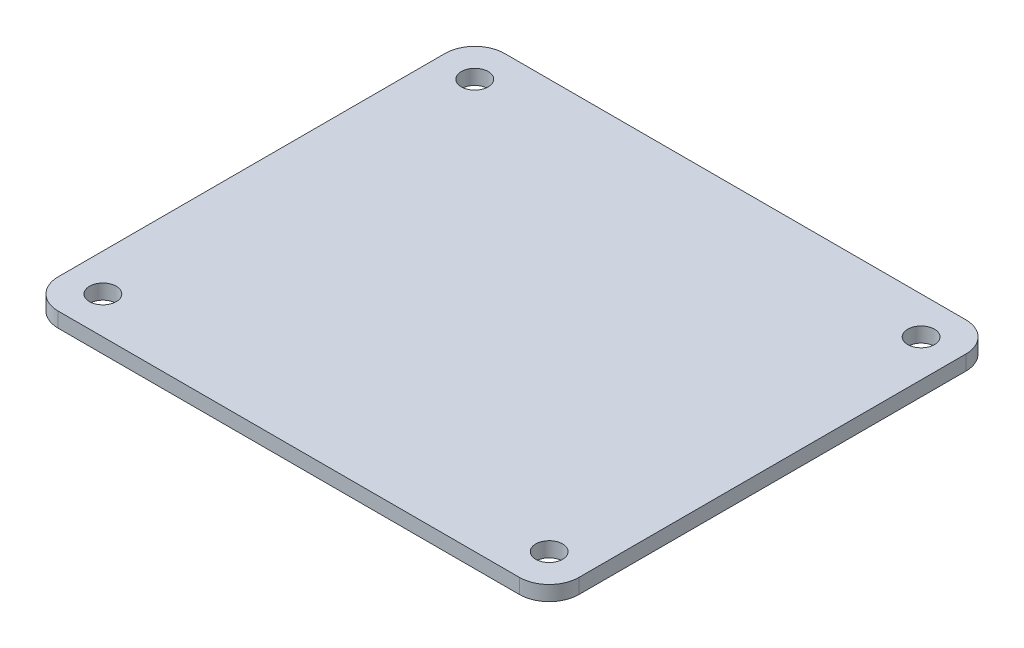
ISO-10303-21;
HEADER;
FILE_DESCRIPTION(('STEP AP214'),'2;1');
FILE_NAME('part.step','',(''),(''),'','','');
FILE_SCHEMA(('AUTOMOTIVE_DESIGN { 1 0 10303 214 1 1 1 1 }'));
ENDSEC;
DATA;
#1=APPLICATION_CONTEXT('core data for automotive mechanical design processes');
#2=APPLICATION_PROTOCOL_DEFINITION('international standard','automotive_design',2000,#1);
#3=PRODUCT_CONTEXT('',#1,'mechanical');
#4=PRODUCT('Part','Part','',(#3));
#5=PRODUCT_RELATED_PRODUCT_CATEGORY('part','',(#4));
#6=PRODUCT_DEFINITION_FORMATION('','',#4);
#7=PRODUCT_DEFINITION_CONTEXT('part definition',#1,'design');
#8=PRODUCT_DEFINITION('design','',#6,#7);
#9=PRODUCT_DEFINITION_SHAPE('','',#8);
#10=(LENGTH_UNIT() NAMED_UNIT(*) SI_UNIT(.MILLI.,.METRE.));
#11=(NAMED_UNIT(*) PLANE_ANGLE_UNIT() SI_UNIT($,.RADIAN.));
#12=(NAMED_UNIT(*) SI_UNIT($,.STERADIAN.) SOLID_ANGLE_UNIT());
#13=UNCERTAINTY_MEASURE_WITH_UNIT(LENGTH_MEASURE(1.E-05),#10,'distance_accuracy_value','');
#14=(GEOMETRIC_REPRESENTATION_CONTEXT(3) GLOBAL_UNCERTAINTY_ASSIGNED_CONTEXT((#13)) GLOBAL_UNIT_ASSIGNED_CONTEXT((#10,
#11,#12)) REPRESENTATION_CONTEXT('',''));
#15=CARTESIAN_POINT('',(0.,0.,0.));
#16=DIRECTION('',(0.,0.,1.));
#17=DIRECTION('',(1.,0.,0.));
#18=AXIS2_PLACEMENT_3D('',#15,#16,#17);
#19=CARTESIAN_POINT('',(61.0820855722367,1.,19.4531884902381));
#20=DIRECTION('',(-1.,0.,0.));
#21=DIRECTION('',(0.,0.,1.));
#22=AXIS2_PLACEMENT_3D('',#19,#20,#21);
#23=PLANE('',#22);
#24=DIRECTION('',(0.,0.,-1.));
#25=VECTOR('',#24,1.);
#26=CARTESIAN_POINT('',(61.0820855722367,1.,19.4531884902381));
#27=LINE('',#26,#25);
#28=CARTESIAN_POINT('',(61.0820855722367,1.,17.4531884902381));
#29=VERTEX_POINT('',#28);
#30=CARTESIAN_POINT('',(61.0820855722367,1.,-8.54681150976191));
#31=VERTEX_POINT('',#30);
#32=EDGE_CURVE('E120',#29,#31,#27,.T.);
#33=ORIENTED_EDGE('',*,*,#32,.F.);
#34=DIRECTION('',(0.,-1.,0.));
#35=VECTOR('',#34,1.);
#36=CARTESIAN_POINT('',(61.0820855722367,1.,17.4531884902381));
#37=LINE('',#36,#35);
#38=CARTESIAN_POINT('',(61.0820855722367,0.,17.4531884902381));
#39=VERTEX_POINT('',#38);
#40=EDGE_CURVE('E105',#29,#39,#37,.T.);
#41=ORIENTED_EDGE('',*,*,#40,.T.);
#42=DIRECTION('',(0.,0.,-1.));
#43=VECTOR('',#42,1.);
#44=CARTESIAN_POINT('',(61.0820855722367,0.,19.4531884902381));
#45=LINE('',#44,#43);
#46=CARTESIAN_POINT('',(61.0820855722367,0.,-8.54681150976191));
#47=VERTEX_POINT('',#46);
#48=EDGE_CURVE('E117',#39,#47,#45,.T.);
#49=ORIENTED_EDGE('',*,*,#48,.T.);
#50=DIRECTION('',(0.,-1.,0.));
#51=VECTOR('',#50,1.);
#52=CARTESIAN_POINT('',(61.0820855722367,1.,-8.54681150976192));
#53=LINE('',#52,#51);
#54=EDGE_CURVE('E122',#47,#31,#53,.F.);
#55=ORIENTED_EDGE('',*,*,#54,.T.);
#56=EDGE_LOOP('',(#33,#41,#49,#55));
#57=FACE_BOUND('',#56,.T.);
#58=ADVANCED_FACE('F35',(#57),#23,.F.);
#59=CARTESIAN_POINT('',(61.0820855722367,1.,-10.5468115097619));
#60=DIRECTION('',(0.,0.,1.));
#61=DIRECTION('',(1.,0.,0.));
#62=AXIS2_PLACEMENT_3D('',#59,#60,#61);
#63=PLANE('',#62);
#64=DIRECTION('',(-1.,0.,0.));
#65=VECTOR('',#64,1.);
#66=CARTESIAN_POINT('',(61.0820855722367,0.,-10.5468115097619));
#67=LINE('',#66,#65);
#68=CARTESIAN_POINT('',(59.0820855722367,0.,-10.5468115097619));
#69=VERTEX_POINT('',#68);
#70=CARTESIAN_POINT('',(28.0820855722367,0.,-10.5468115097619));
#71=VERTEX_POINT('',#70);
#72=EDGE_CURVE('E126',#69,#71,#67,.T.);
#73=ORIENTED_EDGE('',*,*,#72,.T.);
#74=DIRECTION('',(0.,-1.,0.));
#75=VECTOR('',#74,1.);
#76=CARTESIAN_POINT('',(28.0820855722367,1.,-10.5468115097619));
#77=LINE('',#76,#75);
#78=CARTESIAN_POINT('',(28.0820855722367,1.,-10.5468115097619));
#79=VERTEX_POINT('',#78);
#80=EDGE_CURVE('E11',#71,#79,#77,.F.);
#81=ORIENTED_EDGE('',*,*,#80,.T.);
#82=DIRECTION('',(-1.,0.,0.));
#83=VECTOR('',#82,1.);
#84=CARTESIAN_POINT('',(61.0820855722367,1.,-10.5468115097619));
#85=LINE('',#84,#83);
#86=CARTESIAN_POINT('',(59.0820855722367,1.,-10.5468115097619));
#87=VERTEX_POINT('',#86);
#88=EDGE_CURVE('E166',#87,#79,#85,.T.);
#89=ORIENTED_EDGE('',*,*,#88,.F.);
#90=DIRECTION('',(0.,-1.,0.));
#91=VECTOR('',#90,1.);
#92=CARTESIAN_POINT('',(59.0820855722367,1.,-10.5468115097619));
#93=LINE('',#92,#91);
#94=EDGE_CURVE('E43',#87,#69,#93,.T.);
#95=ORIENTED_EDGE('',*,*,#94,.T.);
#96=EDGE_LOOP('',(#73,#81,#89,#95));
#97=FACE_BOUND('',#96,.T.);
#98=ADVANCED_FACE('F164',(#97),#63,.F.);
#99=CARTESIAN_POINT('',(26.0820855722367,1.,19.4531884902381));
#100=DIRECTION('',(1.,0.,0.));
#101=DIRECTION('',(0.,0.,-1.));
#102=AXIS2_PLACEMENT_3D('',#99,#100,#101);
#103=PLANE('',#102);
#104=DIRECTION('',(0.,0.,1.));
#105=VECTOR('',#104,1.);
#106=CARTESIAN_POINT('',(26.0820855722367,0.,19.4531884902381));
#107=LINE('',#106,#105);
#108=CARTESIAN_POINT('',(26.0820855722367,0.,-8.54681150976192));
#109=VERTEX_POINT('',#108);
#110=CARTESIAN_POINT('',(26.0820855722367,0.,17.4531884902381));
#111=VERTEX_POINT('',#110);
#112=EDGE_CURVE('E130',#109,#111,#107,.T.);
#113=ORIENTED_EDGE('',*,*,#112,.T.);
#114=DIRECTION('',(0.,-1.,0.));
#115=VECTOR('',#114,1.);
#116=CARTESIAN_POINT('',(26.0820855722367,1.,17.4531884902381));
#117=LINE('',#116,#115);
#118=CARTESIAN_POINT('',(26.0820855722367,1.,17.4531884902381));
#119=VERTEX_POINT('',#118);
#120=EDGE_CURVE('E50',#111,#119,#117,.F.);
#121=ORIENTED_EDGE('',*,*,#120,.T.);
#122=DIRECTION('',(0.,0.,1.));
#123=VECTOR('',#122,1.);
#124=CARTESIAN_POINT('',(26.0820855722367,1.,19.4531884902381));
#125=LINE('',#124,#123);
#126=CARTESIAN_POINT('',(26.0820855722367,1.,-8.54681150976192));
#127=VERTEX_POINT('',#126);
#128=EDGE_CURVE('E174',#127,#119,#125,.T.);
#129=ORIENTED_EDGE('',*,*,#128,.F.);
#130=DIRECTION('',(0.,-1.,0.));
#131=VECTOR('',#130,1.);
#132=CARTESIAN_POINT('',(26.0820855722367,1.,-8.54681150976192));
#133=LINE('',#132,#131);
#134=EDGE_CURVE('E157',#127,#109,#133,.T.);
#135=ORIENTED_EDGE('',*,*,#134,.T.);
#136=EDGE_LOOP('',(#113,#121,#129,#135));
#137=FACE_BOUND('',#136,.T.);
#138=ADVANCED_FACE('F173',(#137),#103,.F.);
#139=CARTESIAN_POINT('',(61.0820855722367,1.,19.4531884902381));
#140=DIRECTION('',(0.,0.,-1.));
#141=DIRECTION('',(-1.,0.,0.));
#142=AXIS2_PLACEMENT_3D('',#139,#140,#141);
#143=PLANE('',#142);
#144=DIRECTION('',(1.,0.,0.));
#145=VECTOR('',#144,1.);
#146=CARTESIAN_POINT('',(61.0820855722367,0.,19.4531884902381));
#147=LINE('',#146,#145);
#148=CARTESIAN_POINT('',(28.0820855722367,0.,19.4531884902381));
#149=VERTEX_POINT('',#148);
#150=CARTESIAN_POINT('',(59.0820855722367,0.,19.4531884902381));
#151=VERTEX_POINT('',#150);
#152=EDGE_CURVE('E140',#149,#151,#147,.T.);
#153=ORIENTED_EDGE('',*,*,#152,.T.);
#154=DIRECTION('',(0.,-1.,0.));
#155=VECTOR('',#154,1.);
#156=CARTESIAN_POINT('',(59.0820855722367,1.,19.4531884902381));
#157=LINE('',#156,#155);
#158=CARTESIAN_POINT('',(59.0820855722367,1.,19.4531884902381));
#159=VERTEX_POINT('',#158);
#160=EDGE_CURVE('E106',#151,#159,#157,.F.);
#161=ORIENTED_EDGE('',*,*,#160,.T.);
#162=DIRECTION('',(1.,0.,0.));
#163=VECTOR('',#162,1.);
#164=CARTESIAN_POINT('',(61.0820855722367,1.,19.4531884902381));
#165=LINE('',#164,#163);
#166=CARTESIAN_POINT('',(28.0820855722367,1.,19.4531884902381));
#167=VERTEX_POINT('',#166);
#168=EDGE_CURVE('E136',#167,#159,#165,.T.);
#169=ORIENTED_EDGE('',*,*,#168,.F.);
#170=DIRECTION('',(0.,-1.,0.));
#171=VECTOR('',#170,1.);
#172=CARTESIAN_POINT('',(28.0820855722367,1.,19.4531884902381));
#173=LINE('',#172,#171);
#174=EDGE_CURVE('E111',#167,#149,#173,.T.);
#175=ORIENTED_EDGE('',*,*,#174,.T.);
#176=EDGE_LOOP('',(#153,#161,#169,#175));
#177=FACE_BOUND('',#176,.T.);
#178=ADVANCED_FACE('F214',(#177),#143,.F.);
#179=CARTESIAN_POINT('',(0.,1.,0.));
#180=DIRECTION('',(0.,1.,0.));
#181=DIRECTION('',(0.,0.,1.));
#182=AXIS2_PLACEMENT_3D('',#179,#180,#181);
#183=PLANE('',#182);
#184=CARTESIAN_POINT('',(58.5820855722367,1.,-8.04681150976192));
#185=DIRECTION('',(0.,1.,0.));
#186=DIRECTION('',(0.,0.,1.));
#187=AXIS2_PLACEMENT_3D('',#184,#185,#186);
#188=CIRCLE('',#187,0.899999999999997);
#189=CARTESIAN_POINT('',(58.5820855722367,1.,-7.14681150976192));
#190=VERTEX_POINT('',#189);
#191=EDGE_CURVE('E183',#190,#190,#188,.T.);
#192=ORIENTED_EDGE('',*,*,#191,.F.);
#193=EDGE_LOOP('',(#192));
#194=FACE_BOUND('',#193,.T.);
#195=CARTESIAN_POINT('',(28.5820855722367,1.,-8.04681150976192));
#196=DIRECTION('',(0.,1.,0.));
#197=DIRECTION('',(0.,0.,1.));
#198=AXIS2_PLACEMENT_3D('',#195,#196,#197);
#199=CIRCLE('',#198,0.9);
#200=CARTESIAN_POINT('',(28.5820855722367,1.,-7.14681150976192));
#201=VERTEX_POINT('',#200);
#202=EDGE_CURVE('E189',#201,#201,#199,.T.);
#203=ORIENTED_EDGE('',*,*,#202,.F.);
#204=EDGE_LOOP('',(#203));
#205=FACE_BOUND('',#204,.T.);
#206=CARTESIAN_POINT('',(28.5820855722367,1.,16.9531884902381));
#207=DIRECTION('',(0.,1.,0.));
#208=DIRECTION('',(0.,0.,1.));
#209=AXIS2_PLACEMENT_3D('',#206,#207,#208);
#210=CIRCLE('',#209,0.900000000000001);
#211=CARTESIAN_POINT('',(28.5820855722367,1.,17.8531884902381));
#212=VERTEX_POINT('',#211);
#213=EDGE_CURVE('E195',#212,#212,#210,.T.);
#214=ORIENTED_EDGE('',*,*,#213,.F.);
#215=EDGE_LOOP('',(#214));
#216=FACE_BOUND('',#215,.T.);
#217=CARTESIAN_POINT('',(58.5820855722367,1.,16.9531884902381));
#218=DIRECTION('',(0.,1.,0.));
#219=DIRECTION('',(0.,0.,1.));
#220=AXIS2_PLACEMENT_3D('',#217,#218,#219);
#221=CIRCLE('',#220,0.899999999999996);
#222=CARTESIAN_POINT('',(58.5820855722367,1.,17.8531884902381));
#223=VERTEX_POINT('',#222);
#224=EDGE_CURVE('E133',#223,#223,#221,.T.);
#225=ORIENTED_EDGE('',*,*,#224,.F.);
#226=EDGE_LOOP('',(#225));
#227=FACE_BOUND('',#226,.T.);
#228=ORIENTED_EDGE('',*,*,#168,.T.);
#229=CARTESIAN_POINT('',(59.0820855722367,1.,17.4531884902381));
#230=DIRECTION('',(0.,1.,0.));
#231=DIRECTION('',(0.,0.,1.));
#232=AXIS2_PLACEMENT_3D('',#229,#230,#231);
#233=CIRCLE('',#232,2.);
#234=EDGE_CURVE('E155',#159,#29,#233,.T.);
#235=ORIENTED_EDGE('',*,*,#234,.T.);
#236=ORIENTED_EDGE('',*,*,#32,.T.);
#237=CARTESIAN_POINT('',(59.0820855722367,1.,-8.54681150976192));
#238=DIRECTION('',(0.,1.,0.));
#239=DIRECTION('',(0.,0.,1.));
#240=AXIS2_PLACEMENT_3D('',#237,#238,#239);
#241=CIRCLE('',#240,2.);
#242=EDGE_CURVE('E150',#31,#87,#241,.T.);
#243=ORIENTED_EDGE('',*,*,#242,.T.);
#244=ORIENTED_EDGE('',*,*,#88,.T.);
#245=CARTESIAN_POINT('',(28.0820855722367,1.,-8.54681150976192));
#246=DIRECTION('',(0.,1.,0.));
#247=DIRECTION('',(0.,0.,1.));
#248=AXIS2_PLACEMENT_3D('',#245,#246,#247);
#249=CIRCLE('',#248,2.);
#250=EDGE_CURVE('E57',#79,#127,#249,.T.);
#251=ORIENTED_EDGE('',*,*,#250,.T.);
#252=ORIENTED_EDGE('',*,*,#128,.T.);
#253=CARTESIAN_POINT('',(28.0820855722367,1.,17.4531884902381));
#254=DIRECTION('',(0.,1.,0.));
#255=DIRECTION('',(0.,0.,1.));
#256=AXIS2_PLACEMENT_3D('',#253,#254,#255);
#257=CIRCLE('',#256,2.);
#258=EDGE_CURVE('E153',#119,#167,#257,.T.);
#259=ORIENTED_EDGE('',*,*,#258,.T.);
#260=EDGE_LOOP('',(#228,#235,#236,#243,#244,#251,#252,#259));
#261=FACE_BOUND('',#260,.T.);
#262=ADVANCED_FACE('F211',(#194,#205,#216,#227,#261),#183,.T.);
#263=CARTESIAN_POINT('',(0.,0.,0.));
#264=DIRECTION('',(0.,1.,0.));
#265=DIRECTION('',(0.,0.,1.));
#266=AXIS2_PLACEMENT_3D('',#263,#264,#265);
#267=PLANE('',#266);
#268=CARTESIAN_POINT('',(58.5820855722367,0.,-8.04681150976192));
#269=DIRECTION('',(0.,1.,0.));
#270=DIRECTION('',(0.,0.,1.));
#271=AXIS2_PLACEMENT_3D('',#268,#269,#270);
#272=CIRCLE('',#271,0.899999999999997);
#273=CARTESIAN_POINT('',(58.5820855722367,0.,-7.14681150976192));
#274=VERTEX_POINT('',#273);
#275=EDGE_CURVE('E186',#274,#274,#272,.T.);
#276=ORIENTED_EDGE('',*,*,#275,.T.);
#277=EDGE_LOOP('',(#276));
#278=FACE_BOUND('',#277,.T.);
#279=CARTESIAN_POINT('',(28.5820855722367,0.,-8.04681150976192));
#280=DIRECTION('',(0.,1.,0.));
#281=DIRECTION('',(0.,0.,1.));
#282=AXIS2_PLACEMENT_3D('',#279,#280,#281);
#283=CIRCLE('',#282,0.9);
#284=CARTESIAN_POINT('',(28.5820855722367,0.,-7.14681150976192));
#285=VERTEX_POINT('',#284);
#286=EDGE_CURVE('E192',#285,#285,#283,.T.);
#287=ORIENTED_EDGE('',*,*,#286,.T.);
#288=EDGE_LOOP('',(#287));
#289=FACE_BOUND('',#288,.T.);
#290=CARTESIAN_POINT('',(28.5820855722367,0.,16.9531884902381));
#291=DIRECTION('',(0.,1.,0.));
#292=DIRECTION('',(0.,0.,1.));
#293=AXIS2_PLACEMENT_3D('',#290,#291,#292);
#294=CIRCLE('',#293,0.900000000000001);
#295=CARTESIAN_POINT('',(28.5820855722367,0.,17.8531884902381));
#296=VERTEX_POINT('',#295);
#297=EDGE_CURVE('E181',#296,#296,#294,.T.);
#298=ORIENTED_EDGE('',*,*,#297,.T.);
#299=EDGE_LOOP('',(#298));
#300=FACE_BOUND('',#299,.T.);
#301=CARTESIAN_POINT('',(58.5820855722367,0.,16.9531884902381));
#302=DIRECTION('',(0.,1.,0.));
#303=DIRECTION('',(0.,0.,1.));
#304=AXIS2_PLACEMENT_3D('',#301,#302,#303);
#305=CIRCLE('',#304,0.899999999999996);
#306=CARTESIAN_POINT('',(58.5820855722367,0.,17.8531884902381));
#307=VERTEX_POINT('',#306);
#308=EDGE_CURVE('E127',#307,#307,#305,.T.);
#309=ORIENTED_EDGE('',*,*,#308,.T.);
#310=EDGE_LOOP('',(#309));
#311=FACE_BOUND('',#310,.T.);
#312=ORIENTED_EDGE('',*,*,#48,.F.);
#313=CARTESIAN_POINT('',(59.0820855722367,0.,17.4531884902381));
#314=DIRECTION('',(0.,1.,0.));
#315=DIRECTION('',(0.,0.,1.));
#316=AXIS2_PLACEMENT_3D('',#313,#314,#315);
#317=CIRCLE('',#316,2.);
#318=EDGE_CURVE('E101',#39,#151,#317,.F.);
#319=ORIENTED_EDGE('',*,*,#318,.T.);
#320=ORIENTED_EDGE('',*,*,#152,.F.);
#321=CARTESIAN_POINT('',(28.0820855722367,0.,17.4531884902381));
#322=DIRECTION('',(0.,1.,0.));
#323=DIRECTION('',(0.,0.,1.));
#324=AXIS2_PLACEMENT_3D('',#321,#322,#323);
#325=CIRCLE('',#324,2.);
#326=EDGE_CURVE('E112',#149,#111,#325,.F.);
#327=ORIENTED_EDGE('',*,*,#326,.T.);
#328=ORIENTED_EDGE('',*,*,#112,.F.);
#329=CARTESIAN_POINT('',(28.0820855722367,0.,-8.54681150976192));
#330=DIRECTION('',(0.,1.,0.));
#331=DIRECTION('',(0.,0.,1.));
#332=AXIS2_PLACEMENT_3D('',#329,#330,#331);
#333=CIRCLE('',#332,2.);
#334=EDGE_CURVE('E144',#109,#71,#333,.F.);
#335=ORIENTED_EDGE('',*,*,#334,.T.);
#336=ORIENTED_EDGE('',*,*,#72,.F.);
#337=CARTESIAN_POINT('',(59.0820855722367,0.,-8.54681150976192));
#338=DIRECTION('',(0.,1.,0.));
#339=DIRECTION('',(0.,0.,1.));
#340=AXIS2_PLACEMENT_3D('',#337,#338,#339);
#341=CIRCLE('',#340,2.);
#342=EDGE_CURVE('E121',#69,#47,#341,.F.);
#343=ORIENTED_EDGE('',*,*,#342,.T.);
#344=EDGE_LOOP('',(#312,#319,#320,#327,#328,#335,#336,#343));
#345=FACE_BOUND('',#344,.T.);
#346=ADVANCED_FACE('F124',(#278,#289,#300,#311,#345),#267,.F.);
#347=CARTESIAN_POINT('',(59.0820855722367,1.,17.4531884902381));
#348=DIRECTION('',(0.,-1.,0.));
#349=DIRECTION('',(0.,0.,-1.));
#350=AXIS2_PLACEMENT_3D('',#347,#348,#349);
#351=CYLINDRICAL_SURFACE('',#350,2.);
#352=ORIENTED_EDGE('',*,*,#234,.F.);
#353=ORIENTED_EDGE('',*,*,#160,.F.);
#354=ORIENTED_EDGE('',*,*,#318,.F.);
#355=ORIENTED_EDGE('',*,*,#40,.F.);
#356=EDGE_LOOP('',(#352,#353,#354,#355));
#357=FACE_BOUND('',#356,.T.);
#358=ADVANCED_FACE('F104',(#357),#351,.T.);
#359=CARTESIAN_POINT('',(28.0820855722367,1.,17.4531884902381));
#360=DIRECTION('',(0.,-1.,0.));
#361=DIRECTION('',(0.,0.,-1.));
#362=AXIS2_PLACEMENT_3D('',#359,#360,#361);
#363=CYLINDRICAL_SURFACE('',#362,2.);
#364=ORIENTED_EDGE('',*,*,#258,.F.);
#365=ORIENTED_EDGE('',*,*,#120,.F.);
#366=ORIENTED_EDGE('',*,*,#326,.F.);
#367=ORIENTED_EDGE('',*,*,#174,.F.);
#368=EDGE_LOOP('',(#364,#365,#366,#367));
#369=FACE_BOUND('',#368,.T.);
#370=ADVANCED_FACE('F222',(#369),#363,.T.);
#371=CARTESIAN_POINT('',(28.0820855722367,1.,-8.54681150976192));
#372=DIRECTION('',(0.,-1.,0.));
#373=DIRECTION('',(0.,0.,-1.));
#374=AXIS2_PLACEMENT_3D('',#371,#372,#373);
#375=CYLINDRICAL_SURFACE('',#374,2.);
#376=ORIENTED_EDGE('',*,*,#250,.F.);
#377=ORIENTED_EDGE('',*,*,#80,.F.);
#378=ORIENTED_EDGE('',*,*,#334,.F.);
#379=ORIENTED_EDGE('',*,*,#134,.F.);
#380=EDGE_LOOP('',(#376,#377,#378,#379));
#381=FACE_BOUND('',#380,.T.);
#382=ADVANCED_FACE('F172',(#381),#375,.T.);
#383=CARTESIAN_POINT('',(59.0820855722367,1.,-8.54681150976192));
#384=DIRECTION('',(0.,-1.,0.));
#385=DIRECTION('',(0.,0.,-1.));
#386=AXIS2_PLACEMENT_3D('',#383,#384,#385);
#387=CYLINDRICAL_SURFACE('',#386,2.);
#388=ORIENTED_EDGE('',*,*,#242,.F.);
#389=ORIENTED_EDGE('',*,*,#54,.F.);
#390=ORIENTED_EDGE('',*,*,#342,.F.);
#391=ORIENTED_EDGE('',*,*,#94,.F.);
#392=EDGE_LOOP('',(#388,#389,#390,#391));
#393=FACE_BOUND('',#392,.T.);
#394=ADVANCED_FACE('F37',(#393),#387,.T.);
#395=CARTESIAN_POINT('',(58.5820855722367,0.,16.9531884902381));
#396=DIRECTION('',(0.,1.,0.));
#397=DIRECTION('',(0.,0.,1.));
#398=AXIS2_PLACEMENT_3D('',#395,#396,#397);
#399=CYLINDRICAL_SURFACE('',#398,0.899999999999996);
#400=ORIENTED_EDGE('',*,*,#308,.F.);
#401=EDGE_LOOP('',(#400));
#402=FACE_BOUND('',#401,.T.);
#403=ORIENTED_EDGE('',*,*,#224,.T.);
#404=EDGE_LOOP('',(#403));
#405=FACE_BOUND('',#404,.T.);
#406=ADVANCED_FACE('F207',(#402,#405),#399,.F.);
#407=CARTESIAN_POINT('',(28.5820855722367,0.,16.9531884902381));
#408=DIRECTION('',(0.,1.,0.));
#409=DIRECTION('',(0.,0.,1.));
#410=AXIS2_PLACEMENT_3D('',#407,#408,#409);
#411=CYLINDRICAL_SURFACE('',#410,0.900000000000001);
#412=ORIENTED_EDGE('',*,*,#297,.F.);
#413=EDGE_LOOP('',(#412));
#414=FACE_BOUND('',#413,.T.);
#415=ORIENTED_EDGE('',*,*,#213,.T.);
#416=EDGE_LOOP('',(#415));
#417=FACE_BOUND('',#416,.T.);
#418=ADVANCED_FACE('F203',(#414,#417),#411,.F.);
#419=CARTESIAN_POINT('',(28.5820855722367,0.,-8.04681150976192));
#420=DIRECTION('',(0.,1.,0.));
#421=DIRECTION('',(0.,0.,1.));
#422=AXIS2_PLACEMENT_3D('',#419,#420,#421);
#423=CYLINDRICAL_SURFACE('',#422,0.9);
#424=ORIENTED_EDGE('',*,*,#286,.F.);
#425=EDGE_LOOP('',(#424));
#426=FACE_BOUND('',#425,.T.);
#427=ORIENTED_EDGE('',*,*,#202,.T.);
#428=EDGE_LOOP('',(#427));
#429=FACE_BOUND('',#428,.T.);
#430=ADVANCED_FACE('F206',(#426,#429),#423,.F.);
#431=CARTESIAN_POINT('',(58.5820855722367,0.,-8.04681150976192));
#432=DIRECTION('',(0.,1.,0.));
#433=DIRECTION('',(0.,0.,1.));
#434=AXIS2_PLACEMENT_3D('',#431,#432,#433);
#435=CYLINDRICAL_SURFACE('',#434,0.899999999999997);
#436=ORIENTED_EDGE('',*,*,#275,.F.);
#437=EDGE_LOOP('',(#436));
#438=FACE_BOUND('',#437,.T.);
#439=ORIENTED_EDGE('',*,*,#191,.T.);
#440=EDGE_LOOP('',(#439));
#441=FACE_BOUND('',#440,.T.);
#442=ADVANCED_FACE('F247',(#438,#441),#435,.F.);
#443=CLOSED_SHELL('',(#58,#98,#138,#178,#262,#346,#358,#370,#382,#394,#406,#418,#430,#442));
#444=MANIFOLD_SOLID_BREP('B2',#443);
#445=ADVANCED_BREP_SHAPE_REPRESENTATION('',(#18,#444),#14);
#446=SHAPE_DEFINITION_REPRESENTATION(#9,#445);
ENDSEC;
END-ISO-10303-21;
